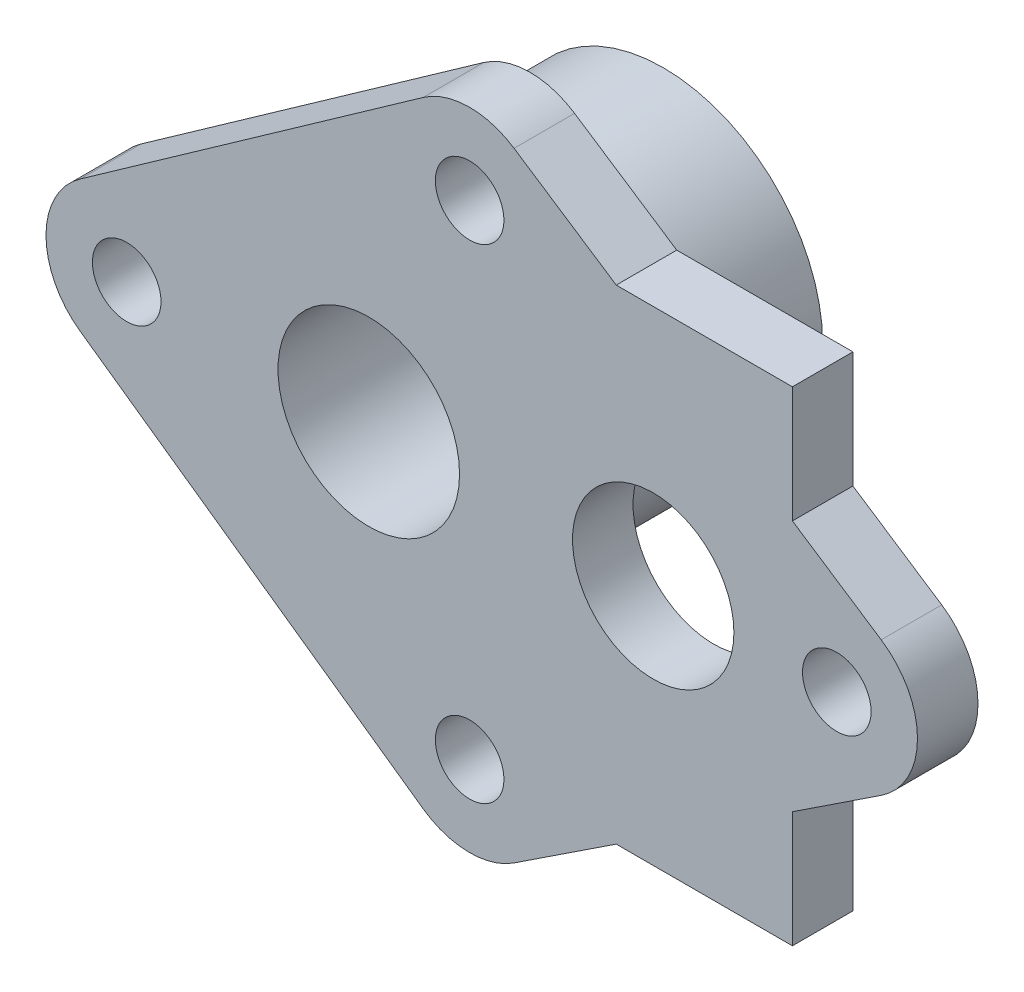
ISO-10303-21;
HEADER;
FILE_DESCRIPTION(('STEP AP214'),'2;1');
FILE_NAME('part.step','',(''),(''),'','','');
FILE_SCHEMA(('AUTOMOTIVE_DESIGN { 1 0 10303 214 1 1 1 1 }'));
ENDSEC;
DATA;
#1=APPLICATION_CONTEXT('core data for automotive mechanical design processes');
#2=APPLICATION_PROTOCOL_DEFINITION('international standard','automotive_design',2000,#1);
#3=PRODUCT_CONTEXT('',#1,'mechanical');
#4=PRODUCT('Part','Part','',(#3));
#5=PRODUCT_RELATED_PRODUCT_CATEGORY('part','',(#4));
#6=PRODUCT_DEFINITION_FORMATION('','',#4);
#7=PRODUCT_DEFINITION_CONTEXT('part definition',#1,'design');
#8=PRODUCT_DEFINITION('design','',#6,#7);
#9=PRODUCT_DEFINITION_SHAPE('','',#8);
#10=(LENGTH_UNIT() NAMED_UNIT(*) SI_UNIT(.MILLI.,.METRE.));
#11=(NAMED_UNIT(*) PLANE_ANGLE_UNIT() SI_UNIT($,.RADIAN.));
#12=(NAMED_UNIT(*) SI_UNIT($,.STERADIAN.) SOLID_ANGLE_UNIT());
#13=UNCERTAINTY_MEASURE_WITH_UNIT(LENGTH_MEASURE(1.E-05),#10,'distance_accuracy_value','');
#14=(GEOMETRIC_REPRESENTATION_CONTEXT(3) GLOBAL_UNCERTAINTY_ASSIGNED_CONTEXT((#13)) GLOBAL_UNIT_ASSIGNED_CONTEXT((#10,
#11,#12)) REPRESENTATION_CONTEXT('',''));
#15=CARTESIAN_POINT('',(0.,0.,0.));
#16=DIRECTION('',(0.,0.,1.));
#17=DIRECTION('',(1.,0.,0.));
#18=AXIS2_PLACEMENT_3D('',#15,#16,#17);
#19=CARTESIAN_POINT('',(9.23154616614763,14.0011783519906,14.6));
#20=DIRECTION('',(0.55045871559633,0.834862385321101,0.));
#21=DIRECTION('',(-0.834862385321101,0.55045871559633,0.));
#22=AXIS2_PLACEMENT_3D('',#19,#20,#21);
#23=PLANE('',#22);
#24=DIRECTION('',(0.834862385321101,-0.55045871559633,0.));
#25=VECTOR('',#24,1.);
#26=CARTESIAN_POINT('',(9.23154616614763,14.0011783519906,11.6));
#27=LINE('',#26,#25);
#28=CARTESIAN_POINT('',(21.,6.24175824175825,11.6));
#29=VERTEX_POINT('',#28);
#30=CARTESIAN_POINT('',(25.4018348623853,3.3394495412844,11.6));
#31=VERTEX_POINT('',#30);
#32=EDGE_CURVE('E121',#29,#31,#27,.T.);
#33=ORIENTED_EDGE('',*,*,#32,.F.);
#34=DIRECTION('',(0.,0.,1.));
#35=VECTOR('',#34,1.);
#36=CARTESIAN_POINT('',(21.,6.24175824175825,11.6));
#37=LINE('',#36,#35);
#38=CARTESIAN_POINT('',(21.,6.24175824175825,14.6));
#39=VERTEX_POINT('',#38);
#40=EDGE_CURVE('E230',#29,#39,#37,.T.);
#41=ORIENTED_EDGE('',*,*,#40,.T.);
#42=DIRECTION('',(0.834862385321101,-0.55045871559633,0.));
#43=VECTOR('',#42,1.);
#44=CARTESIAN_POINT('',(9.23154616614763,14.0011783519906,14.6));
#45=LINE('',#44,#43);
#46=CARTESIAN_POINT('',(25.4018348623853,3.3394495412844,14.6));
#47=VERTEX_POINT('',#46);
#48=EDGE_CURVE('E271',#39,#47,#45,.T.);
#49=ORIENTED_EDGE('',*,*,#48,.T.);
#50=DIRECTION('',(0.,0.,-1.));
#51=VECTOR('',#50,1.);
#52=CARTESIAN_POINT('',(25.4018348623853,3.3394495412844,14.6));
#53=LINE('',#52,#51);
#54=EDGE_CURVE('E332',#47,#31,#53,.T.);
#55=ORIENTED_EDGE('',*,*,#54,.T.);
#56=EDGE_LOOP('',(#33,#41,#49,#55));
#57=FACE_BOUND('',#56,.T.);
#58=ADVANCED_FACE('F105',(#57),#23,.T.);
#59=CARTESIAN_POINT('',(7.20183486238532,15.3394495412844,14.6));
#60=VERTEX_POINT('',#59);
#61=CARTESIAN_POINT('',(12.2666666666667,12.,14.6));
#62=VERTEX_POINT('',#61);
#63=EDGE_CURVE('E272',#60,#62,#45,.T.);
#64=ORIENTED_EDGE('',*,*,#63,.T.);
#65=DIRECTION('',(0.,0.,1.));
#66=VECTOR('',#65,1.);
#67=CARTESIAN_POINT('',(12.2666666666667,12.,11.6));
#68=LINE('',#67,#66);
#69=CARTESIAN_POINT('',(12.2666666666667,12.,11.6));
#70=VERTEX_POINT('',#69);
#71=EDGE_CURVE('E129',#70,#62,#68,.T.);
#72=ORIENTED_EDGE('',*,*,#71,.F.);
#73=CARTESIAN_POINT('',(7.20183486238532,15.3394495412844,11.6));
#74=VERTEX_POINT('',#73);
#75=EDGE_CURVE('E217',#74,#70,#27,.T.);
#76=ORIENTED_EDGE('',*,*,#75,.F.);
#77=DIRECTION('',(0.,0.,-1.));
#78=VECTOR('',#77,1.);
#79=CARTESIAN_POINT('',(7.20183486238532,15.3394495412844,14.6));
#80=LINE('',#79,#78);
#81=EDGE_CURVE('E330',#60,#74,#80,.T.);
#82=ORIENTED_EDGE('',*,*,#81,.F.);
#83=EDGE_LOOP('',(#64,#72,#76,#82));
#84=FACE_BOUND('',#83,.T.);
#85=ADVANCED_FACE('F377',(#84),#23,.T.);
#86=CARTESIAN_POINT('',(9.23154616614763,-14.0011783519906,14.6));
#87=DIRECTION('',(0.55045871559633,-0.834862385321101,0.));
#88=DIRECTION('',(0.834862385321101,0.55045871559633,0.));
#89=AXIS2_PLACEMENT_3D('',#86,#87,#88);
#90=PLANE('',#89);
#91=DIRECTION('',(-0.834862385321101,-0.55045871559633,0.));
#92=VECTOR('',#91,1.);
#93=CARTESIAN_POINT('',(9.23154616614763,-14.0011783519906,11.6));
#94=LINE('',#93,#92);
#95=CARTESIAN_POINT('',(12.2666666666667,-12.,11.6));
#96=VERTEX_POINT('',#95);
#97=CARTESIAN_POINT('',(7.20183486238532,-15.3394495412844,11.6));
#98=VERTEX_POINT('',#97);
#99=EDGE_CURVE('E303',#96,#98,#94,.T.);
#100=ORIENTED_EDGE('',*,*,#99,.F.);
#101=DIRECTION('',(0.,0.,1.));
#102=VECTOR('',#101,1.);
#103=CARTESIAN_POINT('',(12.2666666666667,-12.,11.6));
#104=LINE('',#103,#102);
#105=CARTESIAN_POINT('',(12.2666666666667,-12.,14.6));
#106=VERTEX_POINT('',#105);
#107=EDGE_CURVE('E249',#96,#106,#104,.T.);
#108=ORIENTED_EDGE('',*,*,#107,.T.);
#109=DIRECTION('',(-0.834862385321101,-0.55045871559633,0.));
#110=VECTOR('',#109,1.);
#111=CARTESIAN_POINT('',(9.23154616614763,-14.0011783519906,14.6));
#112=LINE('',#111,#110);
#113=CARTESIAN_POINT('',(7.20183486238532,-15.3394495412844,14.6));
#114=VERTEX_POINT('',#113);
#115=EDGE_CURVE('E268',#106,#114,#112,.T.);
#116=ORIENTED_EDGE('',*,*,#115,.T.);
#117=DIRECTION('',(0.,0.,-1.));
#118=VECTOR('',#117,1.);
#119=CARTESIAN_POINT('',(7.20183486238532,-15.3394495412844,14.6));
#120=LINE('',#119,#118);
#121=EDGE_CURVE('E336',#114,#98,#120,.T.);
#122=ORIENTED_EDGE('',*,*,#121,.T.);
#123=EDGE_LOOP('',(#100,#108,#116,#122));
#124=FACE_BOUND('',#123,.T.);
#125=ADVANCED_FACE('F383',(#124),#90,.T.);
#126=CARTESIAN_POINT('',(25.4018348623853,-3.3394495412844,14.6));
#127=VERTEX_POINT('',#126);
#128=CARTESIAN_POINT('',(21.,-6.24175824175825,14.6));
#129=VERTEX_POINT('',#128);
#130=EDGE_CURVE('E269',#127,#129,#112,.T.);
#131=ORIENTED_EDGE('',*,*,#130,.T.);
#132=DIRECTION('',(0.,0.,1.));
#133=VECTOR('',#132,1.);
#134=CARTESIAN_POINT('',(21.,-6.24175824175825,11.6));
#135=LINE('',#134,#133);
#136=CARTESIAN_POINT('',(21.,-6.24175824175825,11.6));
#137=VERTEX_POINT('',#136);
#138=EDGE_CURVE('E253',#137,#129,#135,.T.);
#139=ORIENTED_EDGE('',*,*,#138,.F.);
#140=CARTESIAN_POINT('',(25.4018348623853,-3.3394495412844,11.6));
#141=VERTEX_POINT('',#140);
#142=EDGE_CURVE('E304',#141,#137,#94,.T.);
#143=ORIENTED_EDGE('',*,*,#142,.F.);
#144=DIRECTION('',(0.,0.,-1.));
#145=VECTOR('',#144,1.);
#146=CARTESIAN_POINT('',(25.4018348623853,-3.3394495412844,14.6));
#147=LINE('',#146,#145);
#148=EDGE_CURVE('E334',#127,#141,#147,.T.);
#149=ORIENTED_EDGE('',*,*,#148,.F.);
#150=EDGE_LOOP('',(#131,#139,#143,#149));
#151=FACE_BOUND('',#150,.T.);
#152=ADVANCED_FACE('F390',(#151),#90,.T.);
#153=CARTESIAN_POINT('',(0.,0.,0.));
#154=DIRECTION('',(0.,0.,1.));
#155=DIRECTION('',(1.,0.,0.));
#156=AXIS2_PLACEMENT_3D('',#153,#154,#155);
#157=PLANE('',#156);
#158=CARTESIAN_POINT('',(0.,0.,0.));
#159=DIRECTION('',(0.,0.,1.));
#160=DIRECTION('',(1.,0.,0.));
#161=AXIS2_PLACEMENT_3D('',#158,#159,#160);
#162=CIRCLE('',#161,4.73260869565217);
#163=CARTESIAN_POINT('',(4.73260869565217,0.,0.));
#164=VERTEX_POINT('',#163);
#165=EDGE_CURVE('E12',#164,#164,#162,.T.);
#166=ORIENTED_EDGE('',*,*,#165,.T.);
#167=EDGE_LOOP('',(#166));
#168=FACE_BOUND('',#167,.T.);
#169=CARTESIAN_POINT('',(0.,0.,0.));
#170=DIRECTION('',(0.,0.,1.));
#171=DIRECTION('',(1.,0.,0.));
#172=AXIS2_PLACEMENT_3D('',#169,#170,#171);
#173=CIRCLE('',#172,7.9);
#174=CARTESIAN_POINT('',(7.9,0.,0.));
#175=VERTEX_POINT('',#174);
#176=EDGE_CURVE('E341',#175,#175,#173,.T.);
#177=ORIENTED_EDGE('',*,*,#176,.F.);
#178=EDGE_LOOP('',(#177));
#179=FACE_BOUND('',#178,.T.);
#180=ADVANCED_FACE('F415',(#168,#179),#157,.F.);
#181=CARTESIAN_POINT('',(0.,0.,11.6));
#182=DIRECTION('',(0.,0.,-1.));
#183=DIRECTION('',(-1.,0.,0.));
#184=AXIS2_PLACEMENT_3D('',#181,#182,#183);
#185=CYLINDRICAL_SURFACE('',#184,7.9);
#186=CARTESIAN_POINT('',(0.,0.,11.6));
#187=DIRECTION('',(0.,0.,1.));
#188=DIRECTION('',(1.,0.,0.));
#189=AXIS2_PLACEMENT_3D('',#186,#187,#188);
#190=CIRCLE('',#189,7.9);
#191=CARTESIAN_POINT('',(7.9,0.,11.6));
#192=VERTEX_POINT('',#191);
#193=EDGE_CURVE('E352',#192,#192,#190,.T.);
#194=ORIENTED_EDGE('',*,*,#193,.F.);
#195=EDGE_LOOP('',(#194));
#196=FACE_BOUND('',#195,.T.);
#197=ORIENTED_EDGE('',*,*,#176,.T.);
#198=EDGE_LOOP('',(#197));
#199=FACE_BOUND('',#198,.T.);
#200=ADVANCED_FACE('F373',(#196,#199),#185,.T.);
#201=CARTESIAN_POINT('',(0.,0.,11.1));
#202=DIRECTION('',(0.,0.,1.));
#203=DIRECTION('',(1.,0.,0.));
#204=AXIS2_PLACEMENT_3D('',#201,#202,#203);
#205=CYLINDRICAL_SURFACE('',#204,4.5);
#206=CARTESIAN_POINT('',(0.,0.,5.34999999999909));
#207=DIRECTION('',(0.,0.,-1.));
#208=DIRECTION('',(-1.,0.,0.));
#209=AXIS2_PLACEMENT_3D('',#206,#207,#208);
#210=CIRCLE('',#209,4.5);
#211=CARTESIAN_POINT('',(-4.5,0.,5.34999999999909));
#212=VERTEX_POINT('',#211);
#213=EDGE_CURVE('E114',#212,#212,#210,.T.);
#214=ORIENTED_EDGE('',*,*,#213,.T.);
#215=EDGE_LOOP('',(#214));
#216=FACE_BOUND('',#215,.T.);
#217=CARTESIAN_POINT('',(0.,0.,14.6));
#218=DIRECTION('',(0.,0.,1.));
#219=DIRECTION('',(1.,0.,0.));
#220=AXIS2_PLACEMENT_3D('',#217,#218,#219);
#221=CIRCLE('',#220,4.5);
#222=CARTESIAN_POINT('',(4.5,0.,14.6));
#223=VERTEX_POINT('',#222);
#224=EDGE_CURVE('E281',#223,#223,#221,.F.);
#225=ORIENTED_EDGE('',*,*,#224,.F.);
#226=EDGE_LOOP('',(#225));
#227=FACE_BOUND('',#226,.T.);
#228=ADVANCED_FACE('F359',(#216,#227),#205,.F.);
#229=CARTESIAN_POINT('',(0.,0.,11.1));
#230=DIRECTION('',(0.,0.,-1.));
#231=DIRECTION('',(-1.,0.,0.));
#232=AXIS2_PLACEMENT_3D('',#229,#230,#231);
#233=CONICAL_SURFACE('',#232,4.24999999999992,0.0434508953915379);
#234=ORIENTED_EDGE('',*,*,#165,.F.);
#235=EDGE_LOOP('',(#234));
#236=FACE_BOUND('',#235,.T.);
#237=ORIENTED_EDGE('',*,*,#213,.F.);
#238=EDGE_LOOP('',(#237));
#239=FACE_BOUND('',#238,.T.);
#240=ADVANCED_FACE('F108',(#236,#239),#233,.F.);
#241=CARTESIAN_POINT('',(5.,-12.,14.6));
#242=DIRECTION('',(0.,0.,-1.));
#243=DIRECTION('',(-1.,0.,0.));
#244=AXIS2_PLACEMENT_3D('',#241,#242,#243);
#245=CYLINDRICAL_SURFACE('',#244,1.7);
#246=CARTESIAN_POINT('',(5.,-12.,14.6));
#247=DIRECTION('',(0.,0.,1.));
#248=DIRECTION('',(1.,0.,0.));
#249=AXIS2_PLACEMENT_3D('',#246,#247,#248);
#250=CIRCLE('',#249,1.7);
#251=CARTESIAN_POINT('',(6.7,-12.,14.6));
#252=VERTEX_POINT('',#251);
#253=EDGE_CURVE('E290',#252,#252,#250,.T.);
#254=ORIENTED_EDGE('',*,*,#253,.T.);
#255=EDGE_LOOP('',(#254));
#256=FACE_BOUND('',#255,.T.);
#257=CARTESIAN_POINT('',(5.,-12.,11.6));
#258=DIRECTION('',(0.,0.,1.));
#259=DIRECTION('',(1.,0.,0.));
#260=AXIS2_PLACEMENT_3D('',#257,#258,#259);
#261=CIRCLE('',#260,1.7);
#262=CARTESIAN_POINT('',(6.7,-12.,11.6));
#263=VERTEX_POINT('',#262);
#264=EDGE_CURVE('E262',#263,#263,#261,.T.);
#265=ORIENTED_EDGE('',*,*,#264,.F.);
#266=EDGE_LOOP('',(#265));
#267=FACE_BOUND('',#266,.T.);
#268=ADVANCED_FACE('F363',(#256,#267),#245,.F.);
#269=CARTESIAN_POINT('',(5.,12.,14.6));
#270=DIRECTION('',(0.,0.,-1.));
#271=DIRECTION('',(-1.,0.,0.));
#272=AXIS2_PLACEMENT_3D('',#269,#270,#271);
#273=CYLINDRICAL_SURFACE('',#272,1.7);
#274=CARTESIAN_POINT('',(5.,12.,14.6));
#275=DIRECTION('',(0.,0.,1.));
#276=DIRECTION('',(1.,0.,0.));
#277=AXIS2_PLACEMENT_3D('',#274,#275,#276);
#278=CIRCLE('',#277,1.7);
#279=CARTESIAN_POINT('',(6.7,12.,14.6));
#280=VERTEX_POINT('',#279);
#281=EDGE_CURVE('E287',#280,#280,#278,.T.);
#282=ORIENTED_EDGE('',*,*,#281,.T.);
#283=EDGE_LOOP('',(#282));
#284=FACE_BOUND('',#283,.T.);
#285=CARTESIAN_POINT('',(5.,12.,11.6));
#286=DIRECTION('',(0.,0.,1.));
#287=DIRECTION('',(1.,0.,0.));
#288=AXIS2_PLACEMENT_3D('',#285,#286,#287);
#289=CIRCLE('',#288,1.7);
#290=CARTESIAN_POINT('',(6.7,12.,11.6));
#291=VERTEX_POINT('',#290);
#292=EDGE_CURVE('E320',#291,#291,#289,.T.);
#293=ORIENTED_EDGE('',*,*,#292,.F.);
#294=EDGE_LOOP('',(#293));
#295=FACE_BOUND('',#294,.T.);
#296=ADVANCED_FACE('F370',(#284,#295),#273,.F.);
#297=CARTESIAN_POINT('',(-12.,0.,14.6));
#298=DIRECTION('',(0.,0.,-1.));
#299=DIRECTION('',(-1.,0.,0.));
#300=AXIS2_PLACEMENT_3D('',#297,#298,#299);
#301=CYLINDRICAL_SURFACE('',#300,1.7);
#302=CARTESIAN_POINT('',(-12.,0.,14.6));
#303=DIRECTION('',(0.,0.,1.));
#304=DIRECTION('',(1.,0.,0.));
#305=AXIS2_PLACEMENT_3D('',#302,#303,#304);
#306=CIRCLE('',#305,1.7);
#307=CARTESIAN_POINT('',(-10.3,0.,14.6));
#308=VERTEX_POINT('',#307);
#309=EDGE_CURVE('E284',#308,#308,#306,.T.);
#310=ORIENTED_EDGE('',*,*,#309,.T.);
#311=EDGE_LOOP('',(#310));
#312=FACE_BOUND('',#311,.T.);
#313=CARTESIAN_POINT('',(-12.,0.,11.6));
#314=DIRECTION('',(0.,0.,1.));
#315=DIRECTION('',(1.,0.,0.));
#316=AXIS2_PLACEMENT_3D('',#313,#314,#315);
#317=CIRCLE('',#316,1.7);
#318=CARTESIAN_POINT('',(-10.3,0.,11.6));
#319=VERTEX_POINT('',#318);
#320=EDGE_CURVE('E317',#319,#319,#317,.T.);
#321=ORIENTED_EDGE('',*,*,#320,.F.);
#322=EDGE_LOOP('',(#321));
#323=FACE_BOUND('',#322,.T.);
#324=ADVANCED_FACE('F395',(#312,#323),#301,.F.);
#325=CARTESIAN_POINT('',(5.,-12.,14.6));
#326=DIRECTION('',(0.,0.,-1.));
#327=DIRECTION('',(-1.,0.,0.));
#328=AXIS2_PLACEMENT_3D('',#325,#326,#327);
#329=CYLINDRICAL_SURFACE('',#328,4.);
#330=CARTESIAN_POINT('',(5.,-12.,11.6));
#331=DIRECTION('',(0.,0.,1.));
#332=DIRECTION('',(1.,0.,0.));
#333=AXIS2_PLACEMENT_3D('',#330,#331,#332);
#334=CIRCLE('',#333,4.);
#335=CARTESIAN_POINT('',(2.69326720960538,-15.267871453059,11.6));
#336=VERTEX_POINT('',#335);
#337=EDGE_CURVE('E300',#336,#98,#334,.T.);
#338=ORIENTED_EDGE('',*,*,#337,.T.);
#339=ORIENTED_EDGE('',*,*,#121,.F.);
#340=CARTESIAN_POINT('',(5.,-12.,14.6));
#341=DIRECTION('',(0.,0.,1.));
#342=DIRECTION('',(1.,0.,0.));
#343=AXIS2_PLACEMENT_3D('',#340,#341,#342);
#344=CIRCLE('',#343,4.);
#345=CARTESIAN_POINT('',(2.69326720960538,-15.267871453059,14.6));
#346=VERTEX_POINT('',#345);
#347=EDGE_CURVE('E265',#346,#114,#344,.T.);
#348=ORIENTED_EDGE('',*,*,#347,.F.);
#349=DIRECTION('',(0.,0.,-1.));
#350=VECTOR('',#349,1.);
#351=CARTESIAN_POINT('',(2.69326720960538,-15.267871453059,14.6));
#352=LINE('',#351,#350);
#353=EDGE_CURVE('E339',#346,#336,#352,.T.);
#354=ORIENTED_EDGE('',*,*,#353,.T.);
#355=EDGE_LOOP('',(#338,#339,#348,#354));
#356=FACE_BOUND('',#355,.T.);
#357=ADVANCED_FACE('F392',(#356),#329,.T.);
#358=CARTESIAN_POINT('',(5.,12.,14.6));
#359=DIRECTION('',(0.,0.,-1.));
#360=DIRECTION('',(-1.,0.,0.));
#361=AXIS2_PLACEMENT_3D('',#358,#359,#360);
#362=CYLINDRICAL_SURFACE('',#361,4.);
#363=CARTESIAN_POINT('',(5.,12.,11.6));
#364=DIRECTION('',(0.,0.,1.));
#365=DIRECTION('',(1.,0.,0.));
#366=AXIS2_PLACEMENT_3D('',#363,#364,#365);
#367=CIRCLE('',#366,4.);
#368=CARTESIAN_POINT('',(2.69326720960538,15.267871453059,11.6));
#369=VERTEX_POINT('',#368);
#370=EDGE_CURVE('E308',#74,#369,#367,.T.);
#371=ORIENTED_EDGE('',*,*,#370,.T.);
#372=DIRECTION('',(0.,0.,-1.));
#373=VECTOR('',#372,1.);
#374=CARTESIAN_POINT('',(2.69326720960538,15.267871453059,14.6));
#375=LINE('',#374,#373);
#376=CARTESIAN_POINT('',(2.69326720960538,15.267871453059,14.6));
#377=VERTEX_POINT('',#376);
#378=EDGE_CURVE('E328',#377,#369,#375,.T.);
#379=ORIENTED_EDGE('',*,*,#378,.F.);
#380=CARTESIAN_POINT('',(5.,12.,14.6));
#381=DIRECTION('',(0.,0.,1.));
#382=DIRECTION('',(1.,0.,0.));
#383=AXIS2_PLACEMENT_3D('',#380,#381,#382);
#384=CIRCLE('',#383,4.);
#385=EDGE_CURVE('E274',#60,#377,#384,.T.);
#386=ORIENTED_EDGE('',*,*,#385,.F.);
#387=ORIENTED_EDGE('',*,*,#81,.T.);
#388=EDGE_LOOP('',(#371,#379,#386,#387));
#389=FACE_BOUND('',#388,.T.);
#390=ADVANCED_FACE('F386',(#389),#362,.T.);
#391=CARTESIAN_POINT('',(-6.29749491510593,8.92145112973341,14.6));
#392=DIRECTION('',(-0.576683197598655,0.816967863264762,0.));
#393=DIRECTION('',(-0.816967863264762,-0.576683197598655,0.));
#394=AXIS2_PLACEMENT_3D('',#391,#392,#393);
#395=PLANE('',#394);
#396=DIRECTION('',(0.816967863264762,0.576683197598655,0.));
#397=VECTOR('',#396,1.);
#398=CARTESIAN_POINT('',(-6.29749491510593,8.92145112973341,11.6));
#399=LINE('',#398,#397);
#400=CARTESIAN_POINT('',(-14.3067327903946,3.26787145305905,11.6));
#401=VERTEX_POINT('',#400);
#402=EDGE_CURVE('E311',#401,#369,#399,.T.);
#403=ORIENTED_EDGE('',*,*,#402,.F.);
#404=DIRECTION('',(0.,0.,-1.));
#405=VECTOR('',#404,1.);
#406=CARTESIAN_POINT('',(-14.3067327903946,3.26787145305905,14.6));
#407=LINE('',#406,#405);
#408=CARTESIAN_POINT('',(-14.3067327903946,3.26787145305905,14.6));
#409=VERTEX_POINT('',#408);
#410=EDGE_CURVE('E326',#409,#401,#407,.T.);
#411=ORIENTED_EDGE('',*,*,#410,.F.);
#412=DIRECTION('',(0.816967863264762,0.576683197598655,0.));
#413=VECTOR('',#412,1.);
#414=CARTESIAN_POINT('',(-6.29749491510593,8.92145112973341,14.6));
#415=LINE('',#414,#413);
#416=EDGE_CURVE('E276',#409,#377,#415,.T.);
#417=ORIENTED_EDGE('',*,*,#416,.T.);
#418=ORIENTED_EDGE('',*,*,#378,.T.);
#419=EDGE_LOOP('',(#403,#411,#417,#418));
#420=FACE_BOUND('',#419,.T.);
#421=ADVANCED_FACE('F446',(#420),#395,.T.);
#422=CARTESIAN_POINT('',(-12.,0.,14.6));
#423=DIRECTION('',(0.,0.,-1.));
#424=DIRECTION('',(-1.,0.,0.));
#425=AXIS2_PLACEMENT_3D('',#422,#423,#424);
#426=CYLINDRICAL_SURFACE('',#425,4.);
#427=CARTESIAN_POINT('',(-12.,0.,11.6));
#428=DIRECTION('',(0.,0.,1.));
#429=DIRECTION('',(1.,0.,0.));
#430=AXIS2_PLACEMENT_3D('',#427,#428,#429);
#431=CIRCLE('',#430,4.);
#432=CARTESIAN_POINT('',(-14.3067327903946,-3.26787145305905,11.6));
#433=VERTEX_POINT('',#432);
#434=EDGE_CURVE('E314',#401,#433,#431,.T.);
#435=ORIENTED_EDGE('',*,*,#434,.T.);
#436=DIRECTION('',(0.,0.,-1.));
#437=VECTOR('',#436,1.);
#438=CARTESIAN_POINT('',(-14.3067327903946,-3.26787145305905,14.6));
#439=LINE('',#438,#437);
#440=CARTESIAN_POINT('',(-14.3067327903946,-3.26787145305905,14.6));
#441=VERTEX_POINT('',#440);
#442=EDGE_CURVE('E293',#441,#433,#439,.T.);
#443=ORIENTED_EDGE('',*,*,#442,.F.);
#444=CARTESIAN_POINT('',(-12.,0.,14.6));
#445=DIRECTION('',(0.,0.,1.));
#446=DIRECTION('',(1.,0.,0.));
#447=AXIS2_PLACEMENT_3D('',#444,#445,#446);
#448=CIRCLE('',#447,4.);
#449=EDGE_CURVE('E279',#409,#441,#448,.T.);
#450=ORIENTED_EDGE('',*,*,#449,.F.);
#451=ORIENTED_EDGE('',*,*,#410,.T.);
#452=EDGE_LOOP('',(#435,#443,#450,#451));
#453=FACE_BOUND('',#452,.T.);
#454=ADVANCED_FACE('F401',(#453),#426,.T.);
#455=CARTESIAN_POINT('',(-6.29749491510594,-8.92145112973342,14.6));
#456=DIRECTION('',(-0.576683197598655,-0.816967863264762,0.));
#457=DIRECTION('',(0.816967863264762,-0.576683197598655,0.));
#458=AXIS2_PLACEMENT_3D('',#455,#456,#457);
#459=PLANE('',#458);
#460=DIRECTION('',(-0.816967863264762,0.576683197598655,0.));
#461=VECTOR('',#460,1.);
#462=CARTESIAN_POINT('',(-6.29749491510594,-8.92145112973342,11.6));
#463=LINE('',#462,#461);
#464=EDGE_CURVE('E297',#336,#433,#463,.T.);
#465=ORIENTED_EDGE('',*,*,#464,.F.);
#466=ORIENTED_EDGE('',*,*,#353,.F.);
#467=DIRECTION('',(-0.816967863264762,0.576683197598655,0.));
#468=VECTOR('',#467,1.);
#469=CARTESIAN_POINT('',(-6.29749491510594,-8.92145112973342,14.6));
#470=LINE('',#469,#468);
#471=EDGE_CURVE('E261',#346,#441,#470,.T.);
#472=ORIENTED_EDGE('',*,*,#471,.T.);
#473=ORIENTED_EDGE('',*,*,#442,.T.);
#474=EDGE_LOOP('',(#465,#466,#472,#473));
#475=FACE_BOUND('',#474,.T.);
#476=ADVANCED_FACE('F397',(#475),#459,.T.);
#477=CARTESIAN_POINT('',(14.1,0.,14.6));
#478=DIRECTION('',(0.,0.,-1.));
#479=DIRECTION('',(-1.,0.,0.));
#480=AXIS2_PLACEMENT_3D('',#477,#478,#479);
#481=CYLINDRICAL_SURFACE('',#480,4.);
#482=CARTESIAN_POINT('',(14.1,0.,14.6));
#483=DIRECTION('',(0.,0.,1.));
#484=DIRECTION('',(1.,0.,0.));
#485=AXIS2_PLACEMENT_3D('',#482,#483,#484);
#486=CIRCLE('',#485,4.);
#487=CARTESIAN_POINT('',(18.1,0.,14.6));
#488=VERTEX_POINT('',#487);
#489=EDGE_CURVE('E258',#488,#488,#486,.T.);
#490=ORIENTED_EDGE('',*,*,#489,.T.);
#491=EDGE_LOOP('',(#490));
#492=FACE_BOUND('',#491,.T.);
#493=CARTESIAN_POINT('',(14.1,0.,11.6));
#494=DIRECTION('',(0.,0.,1.));
#495=DIRECTION('',(1.,0.,0.));
#496=AXIS2_PLACEMENT_3D('',#493,#494,#495);
#497=CIRCLE('',#496,4.);
#498=CARTESIAN_POINT('',(18.1,0.,11.6));
#499=VERTEX_POINT('',#498);
#500=EDGE_CURVE('E294',#499,#499,#497,.T.);
#501=ORIENTED_EDGE('',*,*,#500,.F.);
#502=EDGE_LOOP('',(#501));
#503=FACE_BOUND('',#502,.T.);
#504=ADVANCED_FACE('F400',(#492,#503),#481,.F.);
#505=CARTESIAN_POINT('',(0.,0.,11.6));
#506=DIRECTION('',(0.,0.,1.));
#507=DIRECTION('',(1.,0.,0.));
#508=AXIS2_PLACEMENT_3D('',#505,#506,#507);
#509=PLANE('',#508);
#510=ORIENTED_EDGE('',*,*,#193,.T.);
#511=EDGE_LOOP('',(#510));
#512=FACE_BOUND('',#511,.T.);
#513=ORIENTED_EDGE('',*,*,#500,.T.);
#514=EDGE_LOOP('',(#513));
#515=FACE_BOUND('',#514,.T.);
#516=ORIENTED_EDGE('',*,*,#464,.T.);
#517=ORIENTED_EDGE('',*,*,#434,.F.);
#518=ORIENTED_EDGE('',*,*,#402,.T.);
#519=ORIENTED_EDGE('',*,*,#370,.F.);
#520=ORIENTED_EDGE('',*,*,#75,.T.);
#521=DIRECTION('',(1.,0.,0.));
#522=VECTOR('',#521,1.);
#523=CARTESIAN_POINT('',(0.,12.,11.6));
#524=LINE('',#523,#522);
#525=CARTESIAN_POINT('',(21.,12.,11.6));
#526=VERTEX_POINT('',#525);
#527=EDGE_CURVE('E208',#70,#526,#524,.T.);
#528=ORIENTED_EDGE('',*,*,#527,.T.);
#529=DIRECTION('',(0.,-1.,0.));
#530=VECTOR('',#529,1.);
#531=CARTESIAN_POINT('',(21.,0.,11.6));
#532=LINE('',#531,#530);
#533=EDGE_CURVE('E214',#526,#29,#532,.T.);
#534=ORIENTED_EDGE('',*,*,#533,.T.);
#535=ORIENTED_EDGE('',*,*,#32,.T.);
#536=CARTESIAN_POINT('',(23.2,0.,11.6));
#537=DIRECTION('',(0.,0.,1.));
#538=DIRECTION('',(1.,0.,0.));
#539=AXIS2_PLACEMENT_3D('',#536,#537,#538);
#540=CIRCLE('',#539,4.);
#541=EDGE_CURVE('E345',#141,#31,#540,.T.);
#542=ORIENTED_EDGE('',*,*,#541,.F.);
#543=ORIENTED_EDGE('',*,*,#142,.T.);
#544=DIRECTION('',(0.,-1.,0.));
#545=VECTOR('',#544,1.);
#546=CARTESIAN_POINT('',(21.,0.,11.6));
#547=LINE('',#546,#545);
#548=CARTESIAN_POINT('',(21.,-12.,11.6));
#549=VERTEX_POINT('',#548);
#550=EDGE_CURVE('E242',#137,#549,#547,.T.);
#551=ORIENTED_EDGE('',*,*,#550,.T.);
#552=DIRECTION('',(-1.,0.,0.));
#553=VECTOR('',#552,1.);
#554=CARTESIAN_POINT('',(0.,-12.,11.6));
#555=LINE('',#554,#553);
#556=EDGE_CURVE('E239',#549,#96,#555,.T.);
#557=ORIENTED_EDGE('',*,*,#556,.T.);
#558=ORIENTED_EDGE('',*,*,#99,.T.);
#559=ORIENTED_EDGE('',*,*,#337,.F.);
#560=EDGE_LOOP('',(#516,#517,#518,#519,#520,#528,#534,#535,#542,#543,#551,#557,#558,#559));
#561=FACE_BOUND('',#560,.T.);
#562=ORIENTED_EDGE('',*,*,#320,.T.);
#563=EDGE_LOOP('',(#562));
#564=FACE_BOUND('',#563,.T.);
#565=ORIENTED_EDGE('',*,*,#292,.T.);
#566=EDGE_LOOP('',(#565));
#567=FACE_BOUND('',#566,.T.);
#568=ORIENTED_EDGE('',*,*,#264,.T.);
#569=EDGE_LOOP('',(#568));
#570=FACE_BOUND('',#569,.T.);
#571=CARTESIAN_POINT('',(23.2,0.,11.6));
#572=DIRECTION('',(0.,0.,1.));
#573=DIRECTION('',(1.,0.,0.));
#574=AXIS2_PLACEMENT_3D('',#571,#572,#573);
#575=CIRCLE('',#574,1.7);
#576=CARTESIAN_POINT('',(24.9,0.,11.6));
#577=VERTEX_POINT('',#576);
#578=EDGE_CURVE('E252',#577,#577,#575,.T.);
#579=ORIENTED_EDGE('',*,*,#578,.T.);
#580=EDGE_LOOP('',(#579));
#581=FACE_BOUND('',#580,.T.);
#582=ADVANCED_FACE('F211',(#512,#515,#561,#564,#567,#570,#581),#509,.F.);
#583=CARTESIAN_POINT('',(0.,0.,14.6));
#584=DIRECTION('',(0.,0.,1.));
#585=DIRECTION('',(1.,0.,0.));
#586=AXIS2_PLACEMENT_3D('',#583,#584,#585);
#587=PLANE('',#586);
#588=ORIENTED_EDGE('',*,*,#489,.F.);
#589=EDGE_LOOP('',(#588));
#590=FACE_BOUND('',#589,.T.);
#591=ORIENTED_EDGE('',*,*,#471,.F.);
#592=ORIENTED_EDGE('',*,*,#347,.T.);
#593=ORIENTED_EDGE('',*,*,#115,.F.);
#594=DIRECTION('',(-1.,0.,0.));
#595=VECTOR('',#594,1.);
#596=CARTESIAN_POINT('',(0.,-12.,14.6));
#597=LINE('',#596,#595);
#598=CARTESIAN_POINT('',(21.,-12.,14.6));
#599=VERTEX_POINT('',#598);
#600=EDGE_CURVE('E237',#599,#106,#597,.T.);
#601=ORIENTED_EDGE('',*,*,#600,.F.);
#602=DIRECTION('',(0.,-1.,0.));
#603=VECTOR('',#602,1.);
#604=CARTESIAN_POINT('',(21.,0.,14.6));
#605=LINE('',#604,#603);
#606=EDGE_CURVE('E243',#129,#599,#605,.T.);
#607=ORIENTED_EDGE('',*,*,#606,.F.);
#608=ORIENTED_EDGE('',*,*,#130,.F.);
#609=CARTESIAN_POINT('',(23.2,0.,14.6));
#610=DIRECTION('',(0.,0.,1.));
#611=DIRECTION('',(1.,0.,0.));
#612=AXIS2_PLACEMENT_3D('',#609,#610,#611);
#613=CIRCLE('',#612,4.);
#614=EDGE_CURVE('E298',#127,#47,#613,.T.);
#615=ORIENTED_EDGE('',*,*,#614,.T.);
#616=ORIENTED_EDGE('',*,*,#48,.F.);
#617=DIRECTION('',(0.,-1.,0.));
#618=VECTOR('',#617,1.);
#619=CARTESIAN_POINT('',(21.,0.,14.6));
#620=LINE('',#619,#618);
#621=CARTESIAN_POINT('',(21.,12.,14.6));
#622=VERTEX_POINT('',#621);
#623=EDGE_CURVE('E232',#622,#39,#620,.T.);
#624=ORIENTED_EDGE('',*,*,#623,.F.);
#625=DIRECTION('',(1.,0.,0.));
#626=VECTOR('',#625,1.);
#627=CARTESIAN_POINT('',(0.,12.,14.6));
#628=LINE('',#627,#626);
#629=EDGE_CURVE('E224',#62,#622,#628,.T.);
#630=ORIENTED_EDGE('',*,*,#629,.F.);
#631=ORIENTED_EDGE('',*,*,#63,.F.);
#632=ORIENTED_EDGE('',*,*,#385,.T.);
#633=ORIENTED_EDGE('',*,*,#416,.F.);
#634=ORIENTED_EDGE('',*,*,#449,.T.);
#635=EDGE_LOOP('',(#591,#592,#593,#601,#607,#608,#615,#616,#624,#630,#631,#632,#633,#634));
#636=FACE_BOUND('',#635,.T.);
#637=ORIENTED_EDGE('',*,*,#224,.T.);
#638=EDGE_LOOP('',(#637));
#639=FACE_BOUND('',#638,.T.);
#640=ORIENTED_EDGE('',*,*,#309,.F.);
#641=EDGE_LOOP('',(#640));
#642=FACE_BOUND('',#641,.T.);
#643=ORIENTED_EDGE('',*,*,#281,.F.);
#644=EDGE_LOOP('',(#643));
#645=FACE_BOUND('',#644,.T.);
#646=ORIENTED_EDGE('',*,*,#253,.F.);
#647=EDGE_LOOP('',(#646));
#648=FACE_BOUND('',#647,.T.);
#649=CARTESIAN_POINT('',(23.2,0.,14.6));
#650=DIRECTION('',(0.,0.,1.));
#651=DIRECTION('',(1.,0.,0.));
#652=AXIS2_PLACEMENT_3D('',#649,#650,#651);
#653=CIRCLE('',#652,1.7);
#654=CARTESIAN_POINT('',(24.9,0.,14.6));
#655=VERTEX_POINT('',#654);
#656=EDGE_CURVE('E342',#655,#655,#653,.T.);
#657=ORIENTED_EDGE('',*,*,#656,.F.);
#658=EDGE_LOOP('',(#657));
#659=FACE_BOUND('',#658,.T.);
#660=ADVANCED_FACE('F410',(#590,#636,#639,#642,#645,#648,#659),#587,.T.);
#661=CARTESIAN_POINT('',(23.2,0.,14.6));
#662=DIRECTION('',(0.,0.,-1.));
#663=DIRECTION('',(-1.,0.,0.));
#664=AXIS2_PLACEMENT_3D('',#661,#662,#663);
#665=CYLINDRICAL_SURFACE('',#664,1.7);
#666=ORIENTED_EDGE('',*,*,#656,.T.);
#667=EDGE_LOOP('',(#666));
#668=FACE_BOUND('',#667,.T.);
#669=ORIENTED_EDGE('',*,*,#578,.F.);
#670=EDGE_LOOP('',(#669));
#671=FACE_BOUND('',#670,.T.);
#672=ADVANCED_FACE('F406',(#668,#671),#665,.F.);
#673=CARTESIAN_POINT('',(23.2,0.,14.6));
#674=DIRECTION('',(0.,0.,-1.));
#675=DIRECTION('',(-1.,0.,0.));
#676=AXIS2_PLACEMENT_3D('',#673,#674,#675);
#677=CYLINDRICAL_SURFACE('',#676,4.);
#678=ORIENTED_EDGE('',*,*,#148,.T.);
#679=ORIENTED_EDGE('',*,*,#541,.T.);
#680=ORIENTED_EDGE('',*,*,#54,.F.);
#681=ORIENTED_EDGE('',*,*,#614,.F.);
#682=EDGE_LOOP('',(#678,#679,#680,#681));
#683=FACE_BOUND('',#682,.T.);
#684=ADVANCED_FACE('F409',(#683),#677,.T.);
#685=CARTESIAN_POINT('',(0.,-12.,11.6));
#686=DIRECTION('',(0.,1.,0.));
#687=DIRECTION('',(-1.,0.,0.));
#688=AXIS2_PLACEMENT_3D('',#685,#686,#687);
#689=PLANE('',#688);
#690=ORIENTED_EDGE('',*,*,#600,.T.);
#691=ORIENTED_EDGE('',*,*,#107,.F.);
#692=ORIENTED_EDGE('',*,*,#556,.F.);
#693=DIRECTION('',(0.,0.,1.));
#694=VECTOR('',#693,1.);
#695=CARTESIAN_POINT('',(21.,-12.,11.6));
#696=LINE('',#695,#694);
#697=EDGE_CURVE('E245',#549,#599,#696,.T.);
#698=ORIENTED_EDGE('',*,*,#697,.T.);
#699=EDGE_LOOP('',(#690,#691,#692,#698));
#700=FACE_BOUND('',#699,.T.);
#701=ADVANCED_FACE('F412',(#700),#689,.F.);
#702=CARTESIAN_POINT('',(21.,0.,11.6));
#703=DIRECTION('',(-1.,0.,0.));
#704=DIRECTION('',(0.,0.,1.));
#705=AXIS2_PLACEMENT_3D('',#702,#703,#704);
#706=PLANE('',#705);
#707=ORIENTED_EDGE('',*,*,#606,.T.);
#708=ORIENTED_EDGE('',*,*,#697,.F.);
#709=ORIENTED_EDGE('',*,*,#550,.F.);
#710=ORIENTED_EDGE('',*,*,#138,.T.);
#711=EDGE_LOOP('',(#707,#708,#709,#710));
#712=FACE_BOUND('',#711,.T.);
#713=ADVANCED_FACE('F476',(#712),#706,.F.);
#714=CARTESIAN_POINT('',(21.,0.,11.6));
#715=DIRECTION('',(-1.,0.,0.));
#716=DIRECTION('',(0.,-1.,0.));
#717=AXIS2_PLACEMENT_3D('',#714,#715,#716);
#718=PLANE('',#717);
#719=ORIENTED_EDGE('',*,*,#623,.T.);
#720=ORIENTED_EDGE('',*,*,#40,.F.);
#721=ORIENTED_EDGE('',*,*,#533,.F.);
#722=DIRECTION('',(0.,0.,1.));
#723=VECTOR('',#722,1.);
#724=CARTESIAN_POINT('',(21.,12.,11.6));
#725=LINE('',#724,#723);
#726=EDGE_CURVE('E219',#526,#622,#725,.T.);
#727=ORIENTED_EDGE('',*,*,#726,.T.);
#728=EDGE_LOOP('',(#719,#720,#721,#727));
#729=FACE_BOUND('',#728,.T.);
#730=ADVANCED_FACE('F229',(#729),#718,.F.);
#731=CARTESIAN_POINT('',(0.,12.,11.6));
#732=DIRECTION('',(0.,-1.,0.));
#733=DIRECTION('',(0.,0.,-1.));
#734=AXIS2_PLACEMENT_3D('',#731,#732,#733);
#735=PLANE('',#734);
#736=ORIENTED_EDGE('',*,*,#629,.T.);
#737=ORIENTED_EDGE('',*,*,#726,.F.);
#738=ORIENTED_EDGE('',*,*,#527,.F.);
#739=ORIENTED_EDGE('',*,*,#71,.T.);
#740=EDGE_LOOP('',(#736,#737,#738,#739));
#741=FACE_BOUND('',#740,.T.);
#742=ADVANCED_FACE('F222',(#741),#735,.F.);
#743=CLOSED_SHELL('',(#58,#85,#125,#152,#180,#200,#228,#240,#268,#296,#324,#357,#390,#421,#454,
#476,#504,#582,#660,#672,#684,#701,#713,#730,#742));
#744=MANIFOLD_SOLID_BREP('B2',#743);
#745=ADVANCED_BREP_SHAPE_REPRESENTATION('',(#18,#744),#14);
#746=SHAPE_DEFINITION_REPRESENTATION(#9,#745);
ENDSEC;
END-ISO-10303-21;
